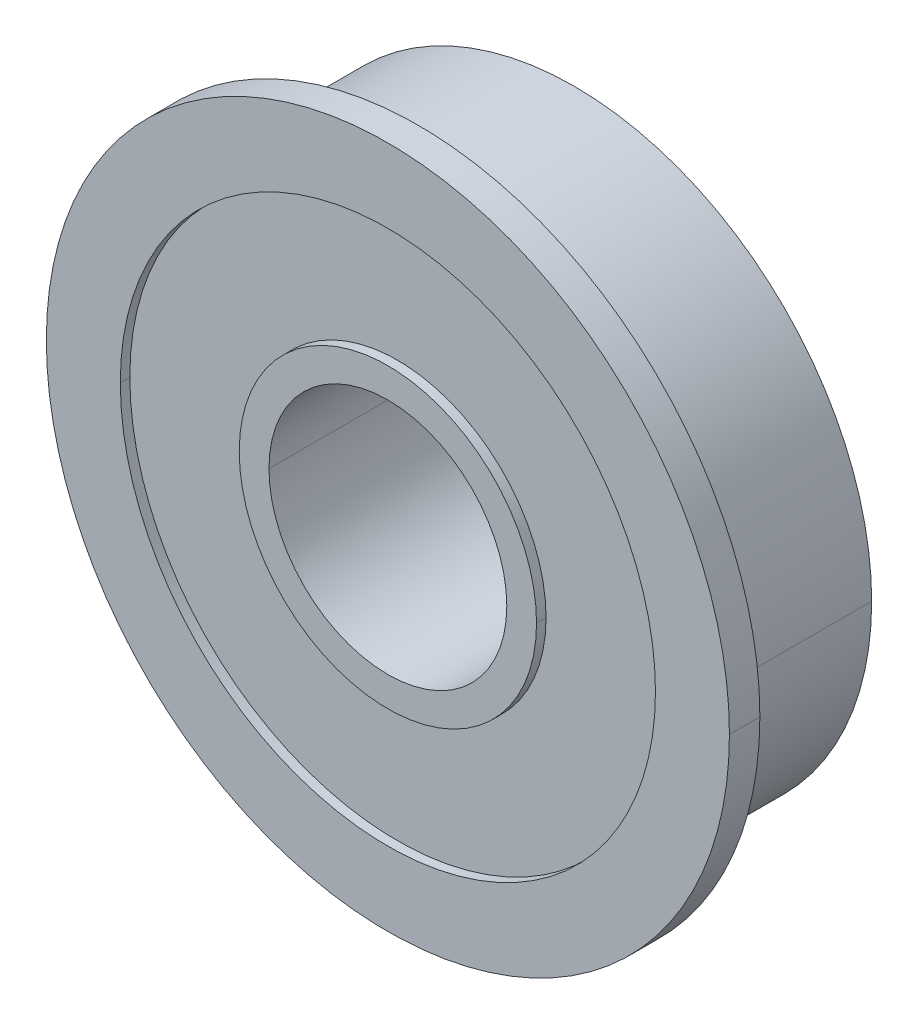
ISO-10303-21;
HEADER;
FILE_DESCRIPTION(('STEP AP214'),'2;1');
FILE_NAME('part.step','',(''),(''),'','','');
FILE_SCHEMA(('AUTOMOTIVE_DESIGN { 1 0 10303 214 1 1 1 1 }'));
ENDSEC;
DATA;
#1=APPLICATION_CONTEXT('core data for automotive mechanical design processes');
#2=APPLICATION_PROTOCOL_DEFINITION('international standard','automotive_design',2000,#1);
#3=PRODUCT_CONTEXT('',#1,'mechanical');
#4=PRODUCT('Part','Part','',(#3));
#5=PRODUCT_RELATED_PRODUCT_CATEGORY('part','',(#4));
#6=PRODUCT_DEFINITION_FORMATION('','',#4);
#7=PRODUCT_DEFINITION_CONTEXT('part definition',#1,'design');
#8=PRODUCT_DEFINITION('design','',#6,#7);
#9=PRODUCT_DEFINITION_SHAPE('','',#8);
#10=(LENGTH_UNIT() NAMED_UNIT(*) SI_UNIT(.MILLI.,.METRE.));
#11=(NAMED_UNIT(*) PLANE_ANGLE_UNIT() SI_UNIT($,.RADIAN.));
#12=(NAMED_UNIT(*) SI_UNIT($,.STERADIAN.) SOLID_ANGLE_UNIT());
#13=UNCERTAINTY_MEASURE_WITH_UNIT(LENGTH_MEASURE(1.E-05),#10,'distance_accuracy_value','');
#14=(GEOMETRIC_REPRESENTATION_CONTEXT(3) GLOBAL_UNCERTAINTY_ASSIGNED_CONTEXT((#13)) GLOBAL_UNIT_ASSIGNED_CONTEXT((#10,
#11,#12)) REPRESENTATION_CONTEXT('',''));
#15=CARTESIAN_POINT('',(0.,0.,0.));
#16=DIRECTION('',(0.,0.,1.));
#17=DIRECTION('',(1.,0.,0.));
#18=AXIS2_PLACEMENT_3D('',#15,#16,#17);
#19=CARTESIAN_POINT('',(0.,0.,-2.4892));
#20=DIRECTION('',(0.,0.,-1.));
#21=DIRECTION('',(-1.,0.,0.));
#22=AXIS2_PLACEMENT_3D('',#19,#20,#21);
#23=CYLINDRICAL_SURFACE('',#22,3.96875);
#24=DIRECTION('',(0.,0.,-1.));
#25=VECTOR('',#24,1.);
#26=CARTESIAN_POINT('',(3.96875,0.,-2.4892));
#27=LINE('',#26,#25);
#28=CARTESIAN_POINT('',(3.96875,0.,-2.2352));
#29=VERTEX_POINT('',#28);
#30=CARTESIAN_POINT('',(3.96875,0.,-2.4892));
#31=VERTEX_POINT('',#30);
#32=EDGE_CURVE('E258',#29,#31,#27,.T.);
#33=ORIENTED_EDGE('',*,*,#32,.F.);
#34=CARTESIAN_POINT('',(0.,0.,-2.2352));
#35=DIRECTION('',(0.,0.,-1.));
#36=DIRECTION('',(-1.,0.,0.));
#37=AXIS2_PLACEMENT_3D('',#34,#35,#36);
#38=CIRCLE('',#37,3.96875);
#39=CARTESIAN_POINT('',(-3.96875,0.,-2.2352));
#40=VERTEX_POINT('',#39);
#41=EDGE_CURVE('E11',#29,#40,#38,.T.);
#42=ORIENTED_EDGE('',*,*,#41,.T.);
#43=DIRECTION('',(0.,0.,-1.));
#44=VECTOR('',#43,1.);
#45=CARTESIAN_POINT('',(-3.96875,0.,-2.4892));
#46=LINE('',#45,#44);
#47=CARTESIAN_POINT('',(-3.96875,0.,-2.4892));
#48=VERTEX_POINT('',#47);
#49=EDGE_CURVE('E220',#40,#48,#46,.T.);
#50=ORIENTED_EDGE('',*,*,#49,.T.);
#51=CARTESIAN_POINT('',(0.,0.,-2.4892));
#52=DIRECTION('',(0.,0.,-1.));
#53=DIRECTION('',(-1.,0.,0.));
#54=AXIS2_PLACEMENT_3D('',#51,#52,#53);
#55=CIRCLE('',#54,3.96875);
#56=EDGE_CURVE('E228',#31,#48,#55,.T.);
#57=ORIENTED_EDGE('',*,*,#56,.F.);
#58=EDGE_LOOP('',(#33,#42,#50,#57));
#59=FACE_BOUND('',#58,.T.);
#60=ADVANCED_FACE('F17',(#59),#23,.T.);
#61=CARTESIAN_POINT('',(7.14375,0.,-2.2352));
#62=DIRECTION('',(0.,0.,1.));
#63=DIRECTION('',(1.,0.,0.));
#64=AXIS2_PLACEMENT_3D('',#61,#62,#63);
#65=PLANE('',#64);
#66=CARTESIAN_POINT('',(0.,0.,-2.2352));
#67=DIRECTION('',(0.,0.,-1.));
#68=DIRECTION('',(-1.,0.,0.));
#69=AXIS2_PLACEMENT_3D('',#66,#67,#68);
#70=CIRCLE('',#69,3.96875);
#71=EDGE_CURVE('E268',#40,#29,#70,.T.);
#72=ORIENTED_EDGE('',*,*,#71,.F.);
#73=ORIENTED_EDGE('',*,*,#41,.F.);
#74=EDGE_LOOP('',(#72,#73));
#75=FACE_BOUND('',#74,.T.);
#76=CARTESIAN_POINT('',(0.,0.,-2.2352));
#77=DIRECTION('',(0.,0.,-1.));
#78=DIRECTION('',(-1.,0.,0.));
#79=AXIS2_PLACEMENT_3D('',#76,#77,#78);
#80=CIRCLE('',#79,7.14375);
#81=CARTESIAN_POINT('',(-7.14375,0.,-2.2352));
#82=VERTEX_POINT('',#81);
#83=CARTESIAN_POINT('',(7.14375,0.,-2.2352));
#84=VERTEX_POINT('',#83);
#85=EDGE_CURVE('E28',#82,#84,#80,.T.);
#86=ORIENTED_EDGE('',*,*,#85,.T.);
#87=CARTESIAN_POINT('',(0.,0.,-2.2352));
#88=DIRECTION('',(0.,0.,-1.));
#89=DIRECTION('',(-1.,0.,0.));
#90=AXIS2_PLACEMENT_3D('',#87,#88,#89);
#91=CIRCLE('',#90,7.14375);
#92=EDGE_CURVE('E211',#84,#82,#91,.T.);
#93=ORIENTED_EDGE('',*,*,#92,.T.);
#94=EDGE_LOOP('',(#86,#93));
#95=FACE_BOUND('',#94,.T.);
#96=ADVANCED_FACE('F356',(#75,#95),#65,.F.);
#97=CARTESIAN_POINT('',(0.,0.,-2.4892));
#98=DIRECTION('',(0.,0.,-1.));
#99=DIRECTION('',(-1.,0.,0.));
#100=AXIS2_PLACEMENT_3D('',#97,#98,#99);
#101=CYLINDRICAL_SURFACE('',#100,7.14375);
#102=DIRECTION('',(0.,0.,-1.));
#103=VECTOR('',#102,1.);
#104=CARTESIAN_POINT('',(7.14375,0.,-2.4892));
#105=LINE('',#104,#103);
#106=CARTESIAN_POINT('',(7.14375,0.,-2.4892));
#107=VERTEX_POINT('',#106);
#108=EDGE_CURVE('E203',#84,#107,#105,.T.);
#109=ORIENTED_EDGE('',*,*,#108,.F.);
#110=ORIENTED_EDGE('',*,*,#85,.F.);
#111=DIRECTION('',(0.,0.,-1.));
#112=VECTOR('',#111,1.);
#113=CARTESIAN_POINT('',(-7.14375,0.,-2.4892));
#114=LINE('',#113,#112);
#115=CARTESIAN_POINT('',(-7.14375,0.,-2.4892));
#116=VERTEX_POINT('',#115);
#117=EDGE_CURVE('E21',#82,#116,#114,.T.);
#118=ORIENTED_EDGE('',*,*,#117,.T.);
#119=CARTESIAN_POINT('',(0.,0.,-2.4892));
#120=DIRECTION('',(0.,0.,-1.));
#121=DIRECTION('',(-1.,0.,0.));
#122=AXIS2_PLACEMENT_3D('',#119,#120,#121);
#123=CIRCLE('',#122,7.14375);
#124=EDGE_CURVE('E90',#116,#107,#123,.T.);
#125=ORIENTED_EDGE('',*,*,#124,.T.);
#126=EDGE_LOOP('',(#109,#110,#118,#125));
#127=FACE_BOUND('',#126,.T.);
#128=ADVANCED_FACE('F19',(#127),#101,.F.);
#129=CARTESIAN_POINT('',(7.9375,0.,-2.4892));
#130=DIRECTION('',(0.,0.,1.));
#131=DIRECTION('',(1.,0.,0.));
#132=AXIS2_PLACEMENT_3D('',#129,#130,#131);
#133=PLANE('',#132);
#134=ORIENTED_EDGE('',*,*,#124,.F.);
#135=CARTESIAN_POINT('',(0.,0.,-2.4892));
#136=DIRECTION('',(0.,0.,-1.));
#137=DIRECTION('',(-1.,0.,0.));
#138=AXIS2_PLACEMENT_3D('',#135,#136,#137);
#139=CIRCLE('',#138,7.14375);
#140=EDGE_CURVE('E201',#107,#116,#139,.T.);
#141=ORIENTED_EDGE('',*,*,#140,.F.);
#142=EDGE_LOOP('',(#134,#141));
#143=FACE_BOUND('',#142,.T.);
#144=CARTESIAN_POINT('',(0.,0.,-2.4892));
#145=DIRECTION('',(0.,0.,-1.));
#146=DIRECTION('',(-1.,0.,0.));
#147=AXIS2_PLACEMENT_3D('',#144,#145,#146);
#148=CIRCLE('',#147,7.9375);
#149=CARTESIAN_POINT('',(-7.9375,0.,-2.4892));
#150=VERTEX_POINT('',#149);
#151=CARTESIAN_POINT('',(7.9375,0.,-2.4892));
#152=VERTEX_POINT('',#151);
#153=EDGE_CURVE('E198',#150,#152,#148,.T.);
#154=ORIENTED_EDGE('',*,*,#153,.T.);
#155=CARTESIAN_POINT('',(0.,0.,-2.4892));
#156=DIRECTION('',(0.,0.,-1.));
#157=DIRECTION('',(-1.,0.,0.));
#158=AXIS2_PLACEMENT_3D('',#155,#156,#157);
#159=CIRCLE('',#158,7.9375);
#160=EDGE_CURVE('E300',#152,#150,#159,.T.);
#161=ORIENTED_EDGE('',*,*,#160,.T.);
#162=EDGE_LOOP('',(#154,#161));
#163=FACE_BOUND('',#162,.T.);
#164=ADVANCED_FACE('F471',(#143,#163),#133,.F.);
#165=CARTESIAN_POINT('',(0.,0.,-2.4892));
#166=DIRECTION('',(0.,0.,-1.));
#167=DIRECTION('',(-1.,0.,0.));
#168=AXIS2_PLACEMENT_3D('',#165,#166,#167);
#169=CYLINDRICAL_SURFACE('',#168,7.9375);
#170=DIRECTION('',(0.,0.,-1.));
#171=VECTOR('',#170,1.);
#172=CARTESIAN_POINT('',(7.9375,0.,-2.4892));
#173=LINE('',#172,#171);
#174=CARTESIAN_POINT('',(7.9375,0.,1.6764));
#175=VERTEX_POINT('',#174);
#176=EDGE_CURVE('E244',#175,#152,#173,.T.);
#177=ORIENTED_EDGE('',*,*,#176,.F.);
#178=CARTESIAN_POINT('',(0.,0.,1.6764));
#179=DIRECTION('',(0.,0.,-1.));
#180=DIRECTION('',(-1.,0.,0.));
#181=AXIS2_PLACEMENT_3D('',#178,#179,#180);
#182=CIRCLE('',#181,7.9375);
#183=CARTESIAN_POINT('',(-7.9375,0.,1.6764));
#184=VERTEX_POINT('',#183);
#185=EDGE_CURVE('E306',#175,#184,#182,.T.);
#186=ORIENTED_EDGE('',*,*,#185,.T.);
#187=DIRECTION('',(0.,0.,-1.));
#188=VECTOR('',#187,1.);
#189=CARTESIAN_POINT('',(-7.9375,0.,-2.4892));
#190=LINE('',#189,#188);
#191=EDGE_CURVE('E191',#184,#150,#190,.T.);
#192=ORIENTED_EDGE('',*,*,#191,.T.);
#193=ORIENTED_EDGE('',*,*,#160,.F.);
#194=EDGE_LOOP('',(#177,#186,#192,#193));
#195=FACE_BOUND('',#194,.T.);
#196=ADVANCED_FACE('F369',(#195),#169,.T.);
#197=CARTESIAN_POINT('',(9.1186,0.,1.6764));
#198=DIRECTION('',(0.,0.,1.));
#199=DIRECTION('',(1.,0.,0.));
#200=AXIS2_PLACEMENT_3D('',#197,#198,#199);
#201=PLANE('',#200);
#202=CARTESIAN_POINT('',(0.,0.,1.6764));
#203=DIRECTION('',(0.,0.,-1.));
#204=DIRECTION('',(-1.,0.,0.));
#205=AXIS2_PLACEMENT_3D('',#202,#203,#204);
#206=CIRCLE('',#205,7.9375);
#207=EDGE_CURVE('E209',#184,#175,#206,.T.);
#208=ORIENTED_EDGE('',*,*,#207,.F.);
#209=ORIENTED_EDGE('',*,*,#185,.F.);
#210=EDGE_LOOP('',(#208,#209));
#211=FACE_BOUND('',#210,.T.);
#212=CARTESIAN_POINT('',(0.,0.,1.6764));
#213=DIRECTION('',(0.,0.,-1.));
#214=DIRECTION('',(-1.,0.,0.));
#215=AXIS2_PLACEMENT_3D('',#212,#213,#214);
#216=CIRCLE('',#215,9.1186);
#217=CARTESIAN_POINT('',(-9.1186,0.,1.6764));
#218=VERTEX_POINT('',#217);
#219=CARTESIAN_POINT('',(9.1186,0.,1.6764));
#220=VERTEX_POINT('',#219);
#221=EDGE_CURVE('E186',#218,#220,#216,.T.);
#222=ORIENTED_EDGE('',*,*,#221,.T.);
#223=CARTESIAN_POINT('',(0.,0.,1.6764));
#224=DIRECTION('',(0.,0.,-1.));
#225=DIRECTION('',(-1.,0.,0.));
#226=AXIS2_PLACEMENT_3D('',#223,#224,#225);
#227=CIRCLE('',#226,9.1186);
#228=EDGE_CURVE('E175',#220,#218,#227,.T.);
#229=ORIENTED_EDGE('',*,*,#228,.T.);
#230=EDGE_LOOP('',(#222,#229));
#231=FACE_BOUND('',#230,.T.);
#232=ADVANCED_FACE('F367',(#211,#231),#201,.F.);
#233=CARTESIAN_POINT('',(0.,0.,-2.4892));
#234=DIRECTION('',(0.,0.,-1.));
#235=DIRECTION('',(-1.,0.,0.));
#236=AXIS2_PLACEMENT_3D('',#233,#234,#235);
#237=CYLINDRICAL_SURFACE('',#236,9.1186);
#238=DIRECTION('',(0.,0.,-1.));
#239=VECTOR('',#238,1.);
#240=CARTESIAN_POINT('',(9.1186,0.,-2.4892));
#241=LINE('',#240,#239);
#242=CARTESIAN_POINT('',(9.1186,0.,2.4892));
#243=VERTEX_POINT('',#242);
#244=EDGE_CURVE('E179',#243,#220,#241,.T.);
#245=ORIENTED_EDGE('',*,*,#244,.F.);
#246=CARTESIAN_POINT('',(0.,0.,2.4892));
#247=DIRECTION('',(0.,0.,-1.));
#248=DIRECTION('',(-1.,0.,0.));
#249=AXIS2_PLACEMENT_3D('',#246,#247,#248);
#250=CIRCLE('',#249,9.1186);
#251=CARTESIAN_POINT('',(-9.1186,0.,2.4892));
#252=VERTEX_POINT('',#251);
#253=EDGE_CURVE('E166',#243,#252,#250,.T.);
#254=ORIENTED_EDGE('',*,*,#253,.T.);
#255=DIRECTION('',(0.,0.,-1.));
#256=VECTOR('',#255,1.);
#257=CARTESIAN_POINT('',(-9.1186,0.,-2.4892));
#258=LINE('',#257,#256);
#259=EDGE_CURVE('E189',#252,#218,#258,.T.);
#260=ORIENTED_EDGE('',*,*,#259,.T.);
#261=ORIENTED_EDGE('',*,*,#228,.F.);
#262=EDGE_LOOP('',(#245,#254,#260,#261));
#263=FACE_BOUND('',#262,.T.);
#264=ADVANCED_FACE('F180',(#263),#237,.T.);
#265=CARTESIAN_POINT('',(7.14375,0.,2.4892));
#266=DIRECTION('',(0.,0.,-1.));
#267=DIRECTION('',(-1.,0.,0.));
#268=AXIS2_PLACEMENT_3D('',#265,#266,#267);
#269=PLANE('',#268);
#270=CARTESIAN_POINT('',(0.,0.,2.4892));
#271=DIRECTION('',(0.,0.,-1.));
#272=DIRECTION('',(-1.,0.,0.));
#273=AXIS2_PLACEMENT_3D('',#270,#271,#272);
#274=CIRCLE('',#273,7.14375);
#275=CARTESIAN_POINT('',(-7.14375,0.,2.4892));
#276=VERTEX_POINT('',#275);
#277=CARTESIAN_POINT('',(7.14375,0.,2.4892));
#278=VERTEX_POINT('',#277);
#279=EDGE_CURVE('E176',#276,#278,#274,.T.);
#280=ORIENTED_EDGE('',*,*,#279,.T.);
#281=CARTESIAN_POINT('',(0.,0.,2.4892));
#282=DIRECTION('',(0.,0.,-1.));
#283=DIRECTION('',(-1.,0.,0.));
#284=AXIS2_PLACEMENT_3D('',#281,#282,#283);
#285=CIRCLE('',#284,7.14375);
#286=EDGE_CURVE('E288',#278,#276,#285,.T.);
#287=ORIENTED_EDGE('',*,*,#286,.T.);
#288=EDGE_LOOP('',(#280,#287));
#289=FACE_BOUND('',#288,.T.);
#290=CARTESIAN_POINT('',(0.,0.,2.4892));
#291=DIRECTION('',(0.,0.,-1.));
#292=DIRECTION('',(-1.,0.,0.));
#293=AXIS2_PLACEMENT_3D('',#290,#291,#292);
#294=CIRCLE('',#293,9.1186);
#295=EDGE_CURVE('E170',#252,#243,#294,.T.);
#296=ORIENTED_EDGE('',*,*,#295,.F.);
#297=ORIENTED_EDGE('',*,*,#253,.F.);
#298=EDGE_LOOP('',(#296,#297));
#299=FACE_BOUND('',#298,.T.);
#300=ADVANCED_FACE('F168',(#289,#299),#269,.F.);
#301=CARTESIAN_POINT('',(0.,0.,-2.4892));
#302=DIRECTION('',(0.,0.,-1.));
#303=DIRECTION('',(-1.,0.,0.));
#304=AXIS2_PLACEMENT_3D('',#301,#302,#303);
#305=CYLINDRICAL_SURFACE('',#304,7.14375);
#306=DIRECTION('',(0.,0.,-1.));
#307=VECTOR('',#306,1.);
#308=CARTESIAN_POINT('',(7.14375,0.,-2.4892));
#309=LINE('',#308,#307);
#310=CARTESIAN_POINT('',(7.14375,0.,2.2352));
#311=VERTEX_POINT('',#310);
#312=EDGE_CURVE('E289',#278,#311,#309,.T.);
#313=ORIENTED_EDGE('',*,*,#312,.F.);
#314=ORIENTED_EDGE('',*,*,#279,.F.);
#315=DIRECTION('',(0.,0.,-1.));
#316=VECTOR('',#315,1.);
#317=CARTESIAN_POINT('',(-7.14375,0.,-2.4892));
#318=LINE('',#317,#316);
#319=CARTESIAN_POINT('',(-7.14375,0.,2.2352));
#320=VERTEX_POINT('',#319);
#321=EDGE_CURVE('E237',#276,#320,#318,.T.);
#322=ORIENTED_EDGE('',*,*,#321,.T.);
#323=CARTESIAN_POINT('',(0.,0.,2.2352));
#324=DIRECTION('',(0.,0.,-1.));
#325=DIRECTION('',(-1.,0.,0.));
#326=AXIS2_PLACEMENT_3D('',#323,#324,#325);
#327=CIRCLE('',#326,7.14375);
#328=EDGE_CURVE('E148',#320,#311,#327,.T.);
#329=ORIENTED_EDGE('',*,*,#328,.T.);
#330=EDGE_LOOP('',(#313,#314,#322,#329));
#331=FACE_BOUND('',#330,.T.);
#332=ADVANCED_FACE('F372',(#331),#305,.F.);
#333=CARTESIAN_POINT('',(3.96875,0.,2.2352));
#334=DIRECTION('',(0.,0.,-1.));
#335=DIRECTION('',(-1.,0.,0.));
#336=AXIS2_PLACEMENT_3D('',#333,#334,#335);
#337=PLANE('',#336);
#338=CARTESIAN_POINT('',(0.,0.,2.2352));
#339=DIRECTION('',(0.,0.,-1.));
#340=DIRECTION('',(-1.,0.,0.));
#341=AXIS2_PLACEMENT_3D('',#338,#339,#340);
#342=CIRCLE('',#341,3.96875);
#343=CARTESIAN_POINT('',(-3.96875,0.,2.2352));
#344=VERTEX_POINT('',#343);
#345=CARTESIAN_POINT('',(3.96875,0.,2.2352));
#346=VERTEX_POINT('',#345);
#347=EDGE_CURVE('E254',#344,#346,#342,.T.);
#348=ORIENTED_EDGE('',*,*,#347,.T.);
#349=CARTESIAN_POINT('',(0.,0.,2.2352));
#350=DIRECTION('',(0.,0.,-1.));
#351=DIRECTION('',(-1.,0.,0.));
#352=AXIS2_PLACEMENT_3D('',#349,#350,#351);
#353=CIRCLE('',#352,3.96875);
#354=EDGE_CURVE('E233',#346,#344,#353,.T.);
#355=ORIENTED_EDGE('',*,*,#354,.T.);
#356=EDGE_LOOP('',(#348,#355));
#357=FACE_BOUND('',#356,.T.);
#358=ORIENTED_EDGE('',*,*,#328,.F.);
#359=CARTESIAN_POINT('',(0.,0.,2.2352));
#360=DIRECTION('',(0.,0.,-1.));
#361=DIRECTION('',(-1.,0.,0.));
#362=AXIS2_PLACEMENT_3D('',#359,#360,#361);
#363=CIRCLE('',#362,7.14375);
#364=EDGE_CURVE('E224',#311,#320,#363,.T.);
#365=ORIENTED_EDGE('',*,*,#364,.F.);
#366=EDGE_LOOP('',(#358,#365));
#367=FACE_BOUND('',#366,.T.);
#368=ADVANCED_FACE('F379',(#357,#367),#337,.F.);
#369=CARTESIAN_POINT('',(0.,0.,-2.4892));
#370=DIRECTION('',(0.,0.,-1.));
#371=DIRECTION('',(-1.,0.,0.));
#372=AXIS2_PLACEMENT_3D('',#369,#370,#371);
#373=CYLINDRICAL_SURFACE('',#372,3.96875);
#374=DIRECTION('',(0.,0.,-1.));
#375=VECTOR('',#374,1.);
#376=CARTESIAN_POINT('',(3.96875,0.,-2.4892));
#377=LINE('',#376,#375);
#378=CARTESIAN_POINT('',(3.96875,0.,2.4892));
#379=VERTEX_POINT('',#378);
#380=EDGE_CURVE('E251',#379,#346,#377,.T.);
#381=ORIENTED_EDGE('',*,*,#380,.F.);
#382=CARTESIAN_POINT('',(0.,0.,2.4892));
#383=DIRECTION('',(0.,0.,-1.));
#384=DIRECTION('',(-1.,0.,0.));
#385=AXIS2_PLACEMENT_3D('',#382,#383,#384);
#386=CIRCLE('',#385,3.96875);
#387=CARTESIAN_POINT('',(-3.96875,0.,2.4892));
#388=VERTEX_POINT('',#387);
#389=EDGE_CURVE('E230',#379,#388,#386,.T.);
#390=ORIENTED_EDGE('',*,*,#389,.T.);
#391=DIRECTION('',(0.,0.,-1.));
#392=VECTOR('',#391,1.);
#393=CARTESIAN_POINT('',(-3.96875,0.,-2.4892));
#394=LINE('',#393,#392);
#395=EDGE_CURVE('E279',#388,#344,#394,.T.);
#396=ORIENTED_EDGE('',*,*,#395,.T.);
#397=ORIENTED_EDGE('',*,*,#354,.F.);
#398=EDGE_LOOP('',(#381,#390,#396,#397));
#399=FACE_BOUND('',#398,.T.);
#400=ADVANCED_FACE('F514',(#399),#373,.T.);
#401=CARTESIAN_POINT('',(3.175,0.,2.4892));
#402=DIRECTION('',(0.,0.,-1.));
#403=DIRECTION('',(-1.,0.,0.));
#404=AXIS2_PLACEMENT_3D('',#401,#402,#403);
#405=PLANE('',#404);
#406=CARTESIAN_POINT('',(0.,0.,2.4892));
#407=DIRECTION('',(0.,0.,-1.));
#408=DIRECTION('',(-1.,0.,0.));
#409=AXIS2_PLACEMENT_3D('',#406,#407,#408);
#410=CIRCLE('',#409,3.175);
#411=CARTESIAN_POINT('',(-3.175,0.,2.4892));
#412=VERTEX_POINT('',#411);
#413=CARTESIAN_POINT('',(3.175,0.,2.4892));
#414=VERTEX_POINT('',#413);
#415=EDGE_CURVE('E234',#412,#414,#410,.T.);
#416=ORIENTED_EDGE('',*,*,#415,.T.);
#417=CARTESIAN_POINT('',(0.,0.,2.4892));
#418=DIRECTION('',(0.,0.,-1.));
#419=DIRECTION('',(-1.,0.,0.));
#420=AXIS2_PLACEMENT_3D('',#417,#418,#419);
#421=CIRCLE('',#420,3.175);
#422=EDGE_CURVE('E284',#414,#412,#421,.T.);
#423=ORIENTED_EDGE('',*,*,#422,.T.);
#424=EDGE_LOOP('',(#416,#423));
#425=FACE_BOUND('',#424,.T.);
#426=CARTESIAN_POINT('',(0.,0.,2.4892));
#427=DIRECTION('',(0.,0.,-1.));
#428=DIRECTION('',(-1.,0.,0.));
#429=AXIS2_PLACEMENT_3D('',#426,#427,#428);
#430=CIRCLE('',#429,3.96875);
#431=EDGE_CURVE('E240',#388,#379,#430,.T.);
#432=ORIENTED_EDGE('',*,*,#431,.F.);
#433=ORIENTED_EDGE('',*,*,#389,.F.);
#434=EDGE_LOOP('',(#432,#433));
#435=FACE_BOUND('',#434,.T.);
#436=ADVANCED_FACE('F351',(#425,#435),#405,.F.);
#437=CARTESIAN_POINT('',(0.,0.,-2.4892));
#438=DIRECTION('',(0.,0.,-1.));
#439=DIRECTION('',(-1.,0.,0.));
#440=AXIS2_PLACEMENT_3D('',#437,#438,#439);
#441=CYLINDRICAL_SURFACE('',#440,3.175);
#442=DIRECTION('',(0.,0.,-1.));
#443=VECTOR('',#442,1.);
#444=CARTESIAN_POINT('',(3.175,0.,-2.4892));
#445=LINE('',#444,#443);
#446=CARTESIAN_POINT('',(3.175,0.,-2.4892));
#447=VERTEX_POINT('',#446);
#448=EDGE_CURVE('E281',#414,#447,#445,.T.);
#449=ORIENTED_EDGE('',*,*,#448,.F.);
#450=ORIENTED_EDGE('',*,*,#415,.F.);
#451=DIRECTION('',(0.,0.,-1.));
#452=VECTOR('',#451,1.);
#453=CARTESIAN_POINT('',(-3.175,0.,-2.4892));
#454=LINE('',#453,#452);
#455=CARTESIAN_POINT('',(-3.175,0.,-2.4892));
#456=VERTEX_POINT('',#455);
#457=EDGE_CURVE('E226',#412,#456,#454,.T.);
#458=ORIENTED_EDGE('',*,*,#457,.T.);
#459=CARTESIAN_POINT('',(0.,0.,-2.4892));
#460=DIRECTION('',(0.,0.,-1.));
#461=DIRECTION('',(-1.,0.,0.));
#462=AXIS2_PLACEMENT_3D('',#459,#460,#461);
#463=CIRCLE('',#462,3.175);
#464=EDGE_CURVE('E42',#456,#447,#463,.T.);
#465=ORIENTED_EDGE('',*,*,#464,.T.);
#466=EDGE_LOOP('',(#449,#450,#458,#465));
#467=FACE_BOUND('',#466,.T.);
#468=ADVANCED_FACE('F341',(#467),#441,.F.);
#469=CARTESIAN_POINT('',(3.96875,0.,-2.4892));
#470=DIRECTION('',(0.,0.,1.));
#471=DIRECTION('',(1.,0.,0.));
#472=AXIS2_PLACEMENT_3D('',#469,#470,#471);
#473=PLANE('',#472);
#474=ORIENTED_EDGE('',*,*,#464,.F.);
#475=CARTESIAN_POINT('',(0.,0.,-2.4892));
#476=DIRECTION('',(0.,0.,-1.));
#477=DIRECTION('',(-1.,0.,0.));
#478=AXIS2_PLACEMENT_3D('',#475,#476,#477);
#479=CIRCLE('',#478,3.175);
#480=EDGE_CURVE('E229',#447,#456,#479,.T.);
#481=ORIENTED_EDGE('',*,*,#480,.F.);
#482=EDGE_LOOP('',(#474,#481));
#483=FACE_BOUND('',#482,.T.);
#484=CARTESIAN_POINT('',(0.,0.,-2.4892));
#485=DIRECTION('',(0.,0.,-1.));
#486=DIRECTION('',(-1.,0.,0.));
#487=AXIS2_PLACEMENT_3D('',#484,#485,#486);
#488=CIRCLE('',#487,3.96875);
#489=EDGE_CURVE('E255',#48,#31,#488,.T.);
#490=ORIENTED_EDGE('',*,*,#489,.T.);
#491=ORIENTED_EDGE('',*,*,#56,.T.);
#492=EDGE_LOOP('',(#490,#491));
#493=FACE_BOUND('',#492,.T.);
#494=ADVANCED_FACE('F339',(#483,#493),#473,.F.);
#495=CARTESIAN_POINT('',(0.,0.,-2.4892));
#496=DIRECTION('',(0.,0.,-1.));
#497=DIRECTION('',(-1.,0.,0.));
#498=AXIS2_PLACEMENT_3D('',#495,#496,#497);
#499=CYLINDRICAL_SURFACE('',#498,3.175);
#500=ORIENTED_EDGE('',*,*,#422,.F.);
#501=ORIENTED_EDGE('',*,*,#448,.T.);
#502=ORIENTED_EDGE('',*,*,#480,.T.);
#503=ORIENTED_EDGE('',*,*,#457,.F.);
#504=EDGE_LOOP('',(#500,#501,#502,#503));
#505=FACE_BOUND('',#504,.T.);
#506=ADVANCED_FACE('F337',(#505),#499,.F.);
#507=CARTESIAN_POINT('',(0.,0.,-2.4892));
#508=DIRECTION('',(0.,0.,-1.));
#509=DIRECTION('',(-1.,0.,0.));
#510=AXIS2_PLACEMENT_3D('',#507,#508,#509);
#511=CYLINDRICAL_SURFACE('',#510,3.96875);
#512=ORIENTED_EDGE('',*,*,#431,.T.);
#513=ORIENTED_EDGE('',*,*,#380,.T.);
#514=ORIENTED_EDGE('',*,*,#347,.F.);
#515=ORIENTED_EDGE('',*,*,#395,.F.);
#516=EDGE_LOOP('',(#512,#513,#514,#515));
#517=FACE_BOUND('',#516,.T.);
#518=ADVANCED_FACE('F349',(#517),#511,.T.);
#519=CARTESIAN_POINT('',(0.,0.,-2.4892));
#520=DIRECTION('',(0.,0.,-1.));
#521=DIRECTION('',(-1.,0.,0.));
#522=AXIS2_PLACEMENT_3D('',#519,#520,#521);
#523=CYLINDRICAL_SURFACE('',#522,7.14375);
#524=ORIENTED_EDGE('',*,*,#286,.F.);
#525=ORIENTED_EDGE('',*,*,#312,.T.);
#526=ORIENTED_EDGE('',*,*,#364,.T.);
#527=ORIENTED_EDGE('',*,*,#321,.F.);
#528=EDGE_LOOP('',(#524,#525,#526,#527));
#529=FACE_BOUND('',#528,.T.);
#530=ADVANCED_FACE('F386',(#529),#523,.F.);
#531=CARTESIAN_POINT('',(0.,0.,-2.4892));
#532=DIRECTION('',(0.,0.,-1.));
#533=DIRECTION('',(-1.,0.,0.));
#534=AXIS2_PLACEMENT_3D('',#531,#532,#533);
#535=CYLINDRICAL_SURFACE('',#534,9.1186);
#536=ORIENTED_EDGE('',*,*,#295,.T.);
#537=ORIENTED_EDGE('',*,*,#244,.T.);
#538=ORIENTED_EDGE('',*,*,#221,.F.);
#539=ORIENTED_EDGE('',*,*,#259,.F.);
#540=EDGE_LOOP('',(#536,#537,#538,#539));
#541=FACE_BOUND('',#540,.T.);
#542=ADVANCED_FACE('F188',(#541),#535,.T.);
#543=CARTESIAN_POINT('',(0.,0.,-2.4892));
#544=DIRECTION('',(0.,0.,-1.));
#545=DIRECTION('',(-1.,0.,0.));
#546=AXIS2_PLACEMENT_3D('',#543,#544,#545);
#547=CYLINDRICAL_SURFACE('',#546,7.9375);
#548=ORIENTED_EDGE('',*,*,#207,.T.);
#549=ORIENTED_EDGE('',*,*,#176,.T.);
#550=ORIENTED_EDGE('',*,*,#153,.F.);
#551=ORIENTED_EDGE('',*,*,#191,.F.);
#552=EDGE_LOOP('',(#548,#549,#550,#551));
#553=FACE_BOUND('',#552,.T.);
#554=ADVANCED_FACE('F492',(#553),#547,.T.);
#555=CARTESIAN_POINT('',(0.,0.,-2.4892));
#556=DIRECTION('',(0.,0.,-1.));
#557=DIRECTION('',(-1.,0.,0.));
#558=AXIS2_PLACEMENT_3D('',#555,#556,#557);
#559=CYLINDRICAL_SURFACE('',#558,7.14375);
#560=ORIENTED_EDGE('',*,*,#92,.F.);
#561=ORIENTED_EDGE('',*,*,#108,.T.);
#562=ORIENTED_EDGE('',*,*,#140,.T.);
#563=ORIENTED_EDGE('',*,*,#117,.F.);
#564=EDGE_LOOP('',(#560,#561,#562,#563));
#565=FACE_BOUND('',#564,.T.);
#566=ADVANCED_FACE('F487',(#565),#559,.F.);
#567=CARTESIAN_POINT('',(0.,0.,-2.4892));
#568=DIRECTION('',(0.,0.,-1.));
#569=DIRECTION('',(-1.,0.,0.));
#570=AXIS2_PLACEMENT_3D('',#567,#568,#569);
#571=CYLINDRICAL_SURFACE('',#570,3.96875);
#572=ORIENTED_EDGE('',*,*,#71,.T.);
#573=ORIENTED_EDGE('',*,*,#32,.T.);
#574=ORIENTED_EDGE('',*,*,#489,.F.);
#575=ORIENTED_EDGE('',*,*,#49,.F.);
#576=EDGE_LOOP('',(#572,#573,#574,#575));
#577=FACE_BOUND('',#576,.T.);
#578=ADVANCED_FACE('F491',(#577),#571,.T.);
#579=CLOSED_SHELL('',(#60,#96,#128,#164,#196,#232,#264,#300,#332,#368,#400,#436,#468,#494,#506,
#518,#530,#542,#554,#566,#578));
#580=MANIFOLD_SOLID_BREP('B1',#579);
#581=ADVANCED_BREP_SHAPE_REPRESENTATION('',(#18,#580),#14);
#582=SHAPE_DEFINITION_REPRESENTATION(#9,#581);
ENDSEC;
END-ISO-10303-21;
